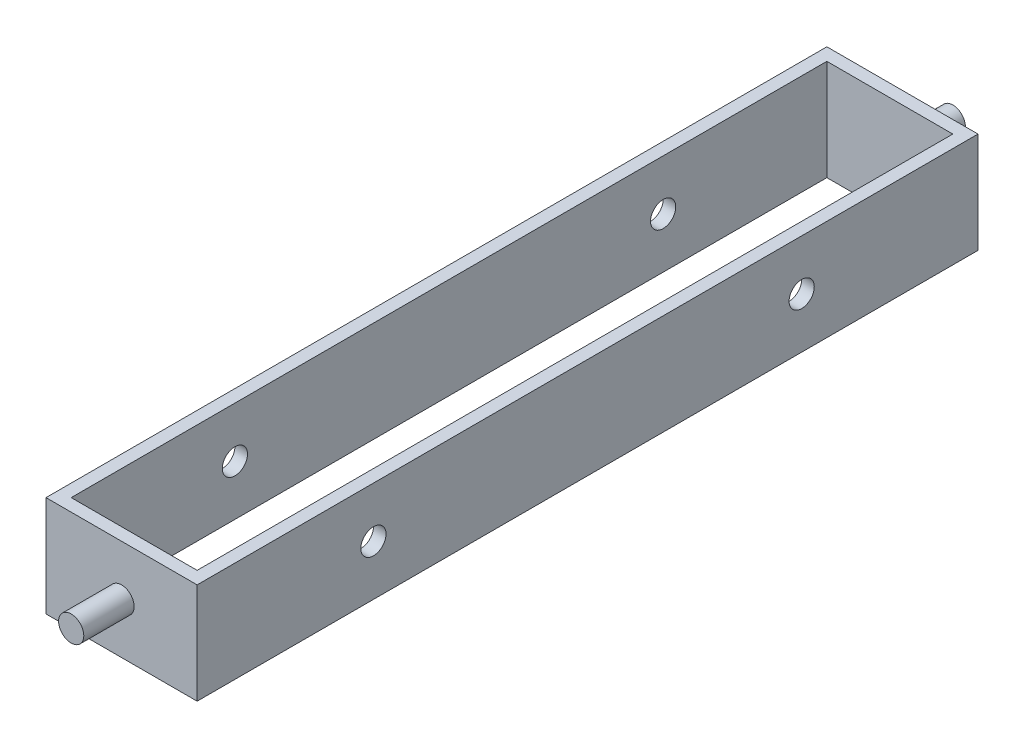
ISO-10303-21;
HEADER;
FILE_DESCRIPTION(('STEP AP214'),'2;1');
FILE_NAME('part.step','',(''),(''),'','','');
FILE_SCHEMA(('AUTOMOTIVE_DESIGN { 1 0 10303 214 1 1 1 1 }'));
ENDSEC;
DATA;
#1=APPLICATION_CONTEXT('core data for automotive mechanical design processes');
#2=APPLICATION_PROTOCOL_DEFINITION('international standard','automotive_design',2000,#1);
#3=PRODUCT_CONTEXT('',#1,'mechanical');
#4=PRODUCT('Part','Part','',(#3));
#5=PRODUCT_RELATED_PRODUCT_CATEGORY('part','',(#4));
#6=PRODUCT_DEFINITION_FORMATION('','',#4);
#7=PRODUCT_DEFINITION_CONTEXT('part definition',#1,'design');
#8=PRODUCT_DEFINITION('design','',#6,#7);
#9=PRODUCT_DEFINITION_SHAPE('','',#8);
#10=(LENGTH_UNIT() NAMED_UNIT(*) SI_UNIT(.MILLI.,.METRE.));
#11=(NAMED_UNIT(*) PLANE_ANGLE_UNIT() SI_UNIT($,.RADIAN.));
#12=(NAMED_UNIT(*) SI_UNIT($,.STERADIAN.) SOLID_ANGLE_UNIT());
#13=UNCERTAINTY_MEASURE_WITH_UNIT(LENGTH_MEASURE(1.E-05),#10,'distance_accuracy_value','');
#14=(GEOMETRIC_REPRESENTATION_CONTEXT(3) GLOBAL_UNCERTAINTY_ASSIGNED_CONTEXT((#13)) GLOBAL_UNIT_ASSIGNED_CONTEXT((#10,
#11,#12)) REPRESENTATION_CONTEXT('',''));
#15=CARTESIAN_POINT('',(0.,0.,0.));
#16=DIRECTION('',(0.,0.,1.));
#17=DIRECTION('',(1.,0.,0.));
#18=AXIS2_PLACEMENT_3D('',#15,#16,#17);
#19=CARTESIAN_POINT('',(0.,0.,25.));
#20=DIRECTION('',(0.,0.,-1.));
#21=DIRECTION('',(-1.,0.,0.));
#22=AXIS2_PLACEMENT_3D('',#19,#20,#21);
#23=PLANE('',#22);
#24=DIRECTION('',(0.,-1.,0.));
#25=VECTOR('',#24,1.);
#26=CARTESIAN_POINT('',(25.,0.,25.));
#27=LINE('',#26,#25);
#28=CARTESIAN_POINT('',(25.,20.,25.));
#29=VERTEX_POINT('',#28);
#30=CARTESIAN_POINT('',(25.,-20.,25.));
#31=VERTEX_POINT('',#30);
#32=EDGE_CURVE('E57',#29,#31,#27,.T.);
#33=ORIENTED_EDGE('',*,*,#32,.F.);
#34=DIRECTION('',(-1.,0.,0.));
#35=VECTOR('',#34,1.);
#36=CARTESIAN_POINT('',(-30.,20.,25.));
#37=LINE('',#36,#35);
#38=CARTESIAN_POINT('',(-25.,20.,25.));
#39=VERTEX_POINT('',#38);
#40=EDGE_CURVE('E174',#29,#39,#37,.T.);
#41=ORIENTED_EDGE('',*,*,#40,.T.);
#42=DIRECTION('',(0.,-1.,0.));
#43=VECTOR('',#42,1.);
#44=CARTESIAN_POINT('',(-25.,0.,25.));
#45=LINE('',#44,#43);
#46=CARTESIAN_POINT('',(-25.,-20.,25.));
#47=VERTEX_POINT('',#46);
#48=EDGE_CURVE('E152',#39,#47,#45,.T.);
#49=ORIENTED_EDGE('',*,*,#48,.T.);
#50=DIRECTION('',(1.,0.,0.));
#51=VECTOR('',#50,1.);
#52=CARTESIAN_POINT('',(-30.,-20.,25.));
#53=LINE('',#52,#51);
#54=EDGE_CURVE('E53',#47,#31,#53,.T.);
#55=ORIENTED_EDGE('',*,*,#54,.T.);
#56=EDGE_LOOP('',(#33,#41,#49,#55));
#57=FACE_BOUND('',#56,.T.);
#58=ADVANCED_FACE('F36',(#57),#23,.F.);
#59=CARTESIAN_POINT('',(0.,0.,20.));
#60=DIRECTION('',(0.,0.,-1.));
#61=DIRECTION('',(-1.,0.,0.));
#62=AXIS2_PLACEMENT_3D('',#59,#60,#61);
#63=CYLINDRICAL_SURFACE('',#62,5.);
#64=CARTESIAN_POINT('',(0.,0.,20.));
#65=DIRECTION('',(0.,0.,1.));
#66=DIRECTION('',(1.,0.,0.));
#67=AXIS2_PLACEMENT_3D('',#64,#65,#66);
#68=CIRCLE('',#67,5.);
#69=CARTESIAN_POINT('',(-5.,0.,20.));
#70=VERTEX_POINT('',#69);
#71=EDGE_CURVE('E11',#70,#70,#68,.T.);
#72=CARTESIAN_POINT('',(0.,0.,0.));
#73=DIRECTION('',(0.,0.,1.));
#74=DIRECTION('',(1.,0.,0.));
#75=AXIS2_PLACEMENT_3D('',#72,#73,#74);
#76=CIRCLE('',#75,5.);
#77=CARTESIAN_POINT('',(-5.,0.,0.));
#78=VERTEX_POINT('',#77);
#79=EDGE_CURVE('E45',#78,#78,#76,.T.);
#80=CARTESIAN_POINT('',(-5.,0.,20.));
#81=CARTESIAN_POINT('',(-5.,0.,19.7916666666667));
#82=CARTESIAN_POINT('',(-5.,0.,19.5833333333334));
#83=CARTESIAN_POINT('',(-5.,0.,19.1666666666667));
#84=CARTESIAN_POINT('',(-5.,0.,18.9583333333334));
#85=CARTESIAN_POINT('',(-5.,0.,18.5416666666667));
#86=CARTESIAN_POINT('',(-5.,0.,18.3333333333334));
#87=CARTESIAN_POINT('',(-5.,0.,17.9166666666667));
#88=CARTESIAN_POINT('',(-5.,0.,17.7083333333334));
#89=CARTESIAN_POINT('',(-5.,0.,17.2916666666667));
#90=CARTESIAN_POINT('',(-5.,0.,17.0833333333334));
#91=CARTESIAN_POINT('',(-5.,0.,16.6666666666667));
#92=CARTESIAN_POINT('',(-5.,0.,16.4583333333334));
#93=CARTESIAN_POINT('',(-5.,0.,16.0416666666667));
#94=CARTESIAN_POINT('',(-5.,0.,15.8333333333334));
#95=CARTESIAN_POINT('',(-5.,0.,15.4166666666667));
#96=CARTESIAN_POINT('',(-5.,0.,15.2083333333334));
#97=CARTESIAN_POINT('',(-5.,0.,14.7916666666667));
#98=CARTESIAN_POINT('',(-5.,0.,14.5833333333334));
#99=CARTESIAN_POINT('',(-5.,0.,14.1666666666667));
#100=CARTESIAN_POINT('',(-5.,0.,13.9583333333334));
#101=CARTESIAN_POINT('',(-5.,0.,13.5416666666667));
#102=CARTESIAN_POINT('',(-5.,0.,13.3333333333334));
#103=CARTESIAN_POINT('',(-5.,0.,12.9166666666667));
#104=CARTESIAN_POINT('',(-5.,0.,12.7083333333334));
#105=CARTESIAN_POINT('',(-5.,0.,12.2916666666667));
#106=CARTESIAN_POINT('',(-5.,0.,12.0833333333334));
#107=CARTESIAN_POINT('',(-5.,0.,11.6666666666667));
#108=CARTESIAN_POINT('',(-5.,0.,11.4583333333334));
#109=CARTESIAN_POINT('',(-5.,0.,11.0416666666667));
#110=CARTESIAN_POINT('',(-5.,0.,10.8333333333334));
#111=CARTESIAN_POINT('',(-5.,0.,10.4166666666667));
#112=CARTESIAN_POINT('',(-5.,0.,10.2083333333333));
#113=CARTESIAN_POINT('',(-5.,0.,9.79166666666668));
#114=CARTESIAN_POINT('',(-5.,0.,9.58333333333335));
#115=CARTESIAN_POINT('',(-5.,0.,9.16666666666668));
#116=CARTESIAN_POINT('',(-5.,0.,8.95833333333335));
#117=CARTESIAN_POINT('',(-5.,0.,8.54166666666668));
#118=CARTESIAN_POINT('',(-5.,0.,8.33333333333335));
#119=CARTESIAN_POINT('',(-5.,0.,7.91666666666668));
#120=CARTESIAN_POINT('',(-5.,0.,7.70833333333335));
#121=CARTESIAN_POINT('',(-5.,0.,7.29166666666668));
#122=CARTESIAN_POINT('',(-5.,0.,7.08333333333335));
#123=CARTESIAN_POINT('',(-5.,0.,6.66666666666668));
#124=CARTESIAN_POINT('',(-5.,0.,6.45833333333334));
#125=CARTESIAN_POINT('',(-5.,0.,6.04166666666667));
#126=CARTESIAN_POINT('',(-5.,0.,5.83333333333334));
#127=CARTESIAN_POINT('',(-5.,0.,5.41666666666667));
#128=CARTESIAN_POINT('',(-5.,0.,5.20833333333334));
#129=CARTESIAN_POINT('',(-5.,0.,4.79166666666667));
#130=CARTESIAN_POINT('',(-5.,0.,4.58333333333334));
#131=CARTESIAN_POINT('',(-5.,0.,4.16666666666667));
#132=CARTESIAN_POINT('',(-5.,0.,3.95833333333334));
#133=CARTESIAN_POINT('',(-5.,0.,3.54166666666667));
#134=CARTESIAN_POINT('',(-5.,0.,3.33333333333334));
#135=CARTESIAN_POINT('',(-5.,0.,2.91666666666667));
#136=CARTESIAN_POINT('',(-5.,0.,2.70833333333334));
#137=CARTESIAN_POINT('',(-5.,0.,2.29166666666667));
#138=CARTESIAN_POINT('',(-5.,0.,2.08333333333334));
#139=CARTESIAN_POINT('',(-5.,0.,1.66666666666667));
#140=CARTESIAN_POINT('',(-5.,0.,1.45833333333333));
#141=CARTESIAN_POINT('',(-5.,0.,1.04166666666666));
#142=CARTESIAN_POINT('',(-5.,0.,0.833333333333331));
#143=CARTESIAN_POINT('',(-5.,0.,0.416666666666664));
#144=CARTESIAN_POINT('',(-5.,0.,0.20833333333333));
#145=CARTESIAN_POINT('',(-5.,0.,0.));
#146=B_SPLINE_CURVE_WITH_KNOTS('',3,(#80,#81,#82,#83,#84,#85,#86,#87,#88,#89,#90,#91,#92,#93,
#94,#95,#96,#97,#98,#99,#100,#101,#102,#103,#104,#105,#106,#107,#108,#109,#110,#111,#112,#113,
#114,#115,#116,#117,#118,#119,#120,#121,#122,#123,#124,#125,#126,#127,#128,#129,#130,#131,#132,
#133,#134,#135,#136,#137,#138,#139,#140,#141,#142,#143,#144,#145),.UNSPECIFIED.,.F.,.F.,(4,2,2,
2,2,2,2,2,2,2,2,2,2,2,2,2,2,2,2,2,2,2,2,2,2,2,2,2,2,2,2,2,4),(0.,0.625000000000001,1.25,1.875,
2.5,3.12500000000001,3.75000000000001,4.37500000000001,5.00000000000001,5.62500000000001,
6.25000000000001,6.87500000000001,7.50000000000001,8.12500000000001,8.75000000000001,
9.37500000000002,10.,10.625,11.25,11.875,12.5,13.125,13.75,14.375,15.,15.625,16.25,16.875,17.5,
18.125,18.75,19.375,20.),.UNSPECIFIED.);
#147=EDGE_CURVE('BSEAM38',#70,#78,#146,.T.);
#148=ORIENTED_EDGE('',*,*,#71,.F.);
#149=ORIENTED_EDGE('',*,*,#79,.T.);
#150=ORIENTED_EDGE('',*,*,#147,.T.);
#151=ORIENTED_EDGE('',*,*,#147,.F.);
#152=EDGE_LOOP('',(#148,#150,#149,#151));
#153=FACE_BOUND('',#152,.T.);
#154=ADVANCED_FACE('F38',(#153),#63,.T.);
#155=CARTESIAN_POINT('',(0.,0.,0.));
#156=DIRECTION('',(0.,0.,1.));
#157=DIRECTION('',(1.,0.,0.));
#158=AXIS2_PLACEMENT_3D('',#155,#156,#157);
#159=PLANE('',#158);
#160=ORIENTED_EDGE('',*,*,#79,.F.);
#161=EDGE_LOOP('',(#160));
#162=FACE_BOUND('',#161,.T.);
#163=ADVANCED_FACE('F222',(#162),#159,.F.);
#164=CARTESIAN_POINT('',(30.,-20.,25.));
#165=DIRECTION('',(-1.,0.,0.));
#166=DIRECTION('',(0.,0.,1.));
#167=AXIS2_PLACEMENT_3D('',#164,#165,#166);
#168=PLANE('',#167);
#169=CARTESIAN_POINT('',(30.,0.,260.));
#170=DIRECTION('',(1.,0.,0.));
#171=DIRECTION('',(0.,0.,1.));
#172=AXIS2_PLACEMENT_3D('',#169,#170,#171);
#173=CIRCLE('',#172,4.99999999999999);
#174=CARTESIAN_POINT('',(30.,0.,265.));
#175=VERTEX_POINT('',#174);
#176=EDGE_CURVE('E284',#175,#175,#173,.T.);
#177=ORIENTED_EDGE('',*,*,#176,.F.);
#178=EDGE_LOOP('',(#177));
#179=FACE_BOUND('',#178,.T.);
#180=CARTESIAN_POINT('',(30.,0.,90.0000000000001));
#181=DIRECTION('',(1.,0.,0.));
#182=DIRECTION('',(0.,0.,-1.));
#183=AXIS2_PLACEMENT_3D('',#180,#181,#182);
#184=CIRCLE('',#183,5.);
#185=CARTESIAN_POINT('',(30.,0.,85.));
#186=VERTEX_POINT('',#185);
#187=EDGE_CURVE('E179',#186,#186,#184,.T.);
#188=ORIENTED_EDGE('',*,*,#187,.F.);
#189=EDGE_LOOP('',(#188));
#190=FACE_BOUND('',#189,.T.);
#191=DIRECTION('',(0.,1.,0.));
#192=VECTOR('',#191,1.);
#193=CARTESIAN_POINT('',(30.,-20.,20.));
#194=LINE('',#193,#192);
#195=CARTESIAN_POINT('',(30.,-20.,20.));
#196=VERTEX_POINT('',#195);
#197=CARTESIAN_POINT('',(30.,20.,20.));
#198=VERTEX_POINT('',#197);
#199=EDGE_CURVE('E171',#196,#198,#194,.T.);
#200=ORIENTED_EDGE('',*,*,#199,.T.);
#201=DIRECTION('',(0.,0.,-1.));
#202=VECTOR('',#201,1.);
#203=CARTESIAN_POINT('',(30.,20.,25.));
#204=LINE('',#203,#202);
#205=CARTESIAN_POINT('',(30.,20.,330.));
#206=VERTEX_POINT('',#205);
#207=EDGE_CURVE('E252',#206,#198,#204,.T.);
#208=ORIENTED_EDGE('',*,*,#207,.F.);
#209=DIRECTION('',(0.,1.,0.));
#210=VECTOR('',#209,1.);
#211=CARTESIAN_POINT('',(30.,20.,330.));
#212=LINE('',#211,#210);
#213=CARTESIAN_POINT('',(30.,-20.,330.));
#214=VERTEX_POINT('',#213);
#215=EDGE_CURVE('E122',#214,#206,#212,.T.);
#216=ORIENTED_EDGE('',*,*,#215,.F.);
#217=DIRECTION('',(0.,0.,-1.));
#218=VECTOR('',#217,1.);
#219=CARTESIAN_POINT('',(30.,-20.,25.));
#220=LINE('',#219,#218);
#221=EDGE_CURVE('E113',#214,#196,#220,.T.);
#222=ORIENTED_EDGE('',*,*,#221,.T.);
#223=EDGE_LOOP('',(#200,#208,#216,#222));
#224=FACE_BOUND('',#223,.T.);
#225=ADVANCED_FACE('F241',(#179,#190,#224),#168,.F.);
#226=CARTESIAN_POINT('',(-30.,20.,25.));
#227=DIRECTION('',(0.,-1.,0.));
#228=DIRECTION('',(0.,0.,-1.));
#229=AXIS2_PLACEMENT_3D('',#226,#227,#228);
#230=PLANE('',#229);
#231=DIRECTION('',(0.,0.,-1.));
#232=VECTOR('',#231,1.);
#233=CARTESIAN_POINT('',(-30.,20.,25.));
#234=LINE('',#233,#232);
#235=CARTESIAN_POINT('',(-30.,20.,330.));
#236=VERTEX_POINT('',#235);
#237=CARTESIAN_POINT('',(-30.,20.,20.));
#238=VERTEX_POINT('',#237);
#239=EDGE_CURVE('E112',#236,#238,#234,.T.);
#240=ORIENTED_EDGE('',*,*,#239,.F.);
#241=DIRECTION('',(-1.,0.,0.));
#242=VECTOR('',#241,1.);
#243=CARTESIAN_POINT('',(-30.,20.,330.));
#244=LINE('',#243,#242);
#245=EDGE_CURVE('E127',#206,#236,#244,.T.);
#246=ORIENTED_EDGE('',*,*,#245,.F.);
#247=ORIENTED_EDGE('',*,*,#207,.T.);
#248=DIRECTION('',(-1.,0.,0.));
#249=VECTOR('',#248,1.);
#250=CARTESIAN_POINT('',(-30.,20.,20.));
#251=LINE('',#250,#249);
#252=EDGE_CURVE('E260',#198,#238,#251,.T.);
#253=ORIENTED_EDGE('',*,*,#252,.T.);
#254=EDGE_LOOP('',(#240,#246,#247,#253));
#255=FACE_BOUND('',#254,.T.);
#256=DIRECTION('',(-1.,0.,0.));
#257=VECTOR('',#256,1.);
#258=CARTESIAN_POINT('',(-30.,20.,325.));
#259=LINE('',#258,#257);
#260=CARTESIAN_POINT('',(25.,20.,325.));
#261=VERTEX_POINT('',#260);
#262=CARTESIAN_POINT('',(-25.,20.,325.));
#263=VERTEX_POINT('',#262);
#264=EDGE_CURVE('E128',#261,#263,#259,.T.);
#265=ORIENTED_EDGE('',*,*,#264,.T.);
#266=DIRECTION('',(0.,0.,-1.));
#267=VECTOR('',#266,1.);
#268=CARTESIAN_POINT('',(-25.,20.,325.));
#269=LINE('',#268,#267);
#270=EDGE_CURVE('E166',#263,#39,#269,.T.);
#271=ORIENTED_EDGE('',*,*,#270,.T.);
#272=ORIENTED_EDGE('',*,*,#40,.F.);
#273=DIRECTION('',(0.,0.,-1.));
#274=VECTOR('',#273,1.);
#275=CARTESIAN_POINT('',(25.,20.,325.));
#276=LINE('',#275,#274);
#277=EDGE_CURVE('E149',#261,#29,#276,.T.);
#278=ORIENTED_EDGE('',*,*,#277,.F.);
#279=EDGE_LOOP('',(#265,#271,#272,#278));
#280=FACE_BOUND('',#279,.T.);
#281=ADVANCED_FACE('F237',(#255,#280),#230,.F.);
#282=CARTESIAN_POINT('',(-30.,-20.,25.));
#283=DIRECTION('',(1.,0.,0.));
#284=DIRECTION('',(0.,0.,-1.));
#285=AXIS2_PLACEMENT_3D('',#282,#283,#284);
#286=PLANE('',#285);
#287=CARTESIAN_POINT('',(-30.,0.,260.));
#288=DIRECTION('',(1.,0.,0.));
#289=DIRECTION('',(0.,0.,-1.));
#290=AXIS2_PLACEMENT_3D('',#287,#288,#289);
#291=CIRCLE('',#290,4.99999999999999);
#292=CARTESIAN_POINT('',(-30.,0.,255.));
#293=VERTEX_POINT('',#292);
#294=EDGE_CURVE('E186',#293,#293,#291,.T.);
#295=ORIENTED_EDGE('',*,*,#294,.T.);
#296=EDGE_LOOP('',(#295));
#297=FACE_BOUND('',#296,.T.);
#298=CARTESIAN_POINT('',(-30.,0.,90.0000000000001));
#299=DIRECTION('',(1.,0.,0.));
#300=DIRECTION('',(0.,0.,-1.));
#301=AXIS2_PLACEMENT_3D('',#298,#299,#300);
#302=CIRCLE('',#301,5.);
#303=CARTESIAN_POINT('',(-30.,0.,85.));
#304=VERTEX_POINT('',#303);
#305=EDGE_CURVE('E183',#304,#304,#302,.T.);
#306=ORIENTED_EDGE('',*,*,#305,.T.);
#307=EDGE_LOOP('',(#306));
#308=FACE_BOUND('',#307,.T.);
#309=DIRECTION('',(0.,-1.,0.));
#310=VECTOR('',#309,1.);
#311=CARTESIAN_POINT('',(-30.,-20.,20.));
#312=LINE('',#311,#310);
#313=CARTESIAN_POINT('',(-30.,-20.,20.));
#314=VERTEX_POINT('',#313);
#315=EDGE_CURVE('E109',#238,#314,#312,.T.);
#316=ORIENTED_EDGE('',*,*,#315,.T.);
#317=DIRECTION('',(0.,0.,-1.));
#318=VECTOR('',#317,1.);
#319=CARTESIAN_POINT('',(-30.,-20.,25.));
#320=LINE('',#319,#318);
#321=CARTESIAN_POINT('',(-30.,-20.,330.));
#322=VERTEX_POINT('',#321);
#323=EDGE_CURVE('E102',#322,#314,#320,.T.);
#324=ORIENTED_EDGE('',*,*,#323,.F.);
#325=DIRECTION('',(0.,-1.,0.));
#326=VECTOR('',#325,1.);
#327=CARTESIAN_POINT('',(-30.,20.,330.));
#328=LINE('',#327,#326);
#329=EDGE_CURVE('E107',#236,#322,#328,.T.);
#330=ORIENTED_EDGE('',*,*,#329,.F.);
#331=ORIENTED_EDGE('',*,*,#239,.T.);
#332=EDGE_LOOP('',(#316,#324,#330,#331));
#333=FACE_BOUND('',#332,.T.);
#334=ADVANCED_FACE('F104',(#297,#308,#333),#286,.F.);
#335=CARTESIAN_POINT('',(-30.,-20.,25.));
#336=DIRECTION('',(0.,1.,0.));
#337=DIRECTION('',(0.,0.,1.));
#338=AXIS2_PLACEMENT_3D('',#335,#336,#337);
#339=PLANE('',#338);
#340=DIRECTION('',(0.,0.,-1.));
#341=VECTOR('',#340,1.);
#342=CARTESIAN_POINT('',(-25.,-20.,325.));
#343=LINE('',#342,#341);
#344=CARTESIAN_POINT('',(-25.,-20.,325.));
#345=VERTEX_POINT('',#344);
#346=EDGE_CURVE('E156',#345,#47,#343,.T.);
#347=ORIENTED_EDGE('',*,*,#346,.F.);
#348=DIRECTION('',(1.,0.,0.));
#349=VECTOR('',#348,1.);
#350=CARTESIAN_POINT('',(-30.,-20.,325.));
#351=LINE('',#350,#349);
#352=CARTESIAN_POINT('',(25.,-20.,325.));
#353=VERTEX_POINT('',#352);
#354=EDGE_CURVE('E131',#345,#353,#351,.T.);
#355=ORIENTED_EDGE('',*,*,#354,.T.);
#356=DIRECTION('',(0.,0.,-1.));
#357=VECTOR('',#356,1.);
#358=CARTESIAN_POINT('',(25.,-20.,325.));
#359=LINE('',#358,#357);
#360=EDGE_CURVE('E145',#353,#31,#359,.T.);
#361=ORIENTED_EDGE('',*,*,#360,.T.);
#362=ORIENTED_EDGE('',*,*,#54,.F.);
#363=EDGE_LOOP('',(#347,#355,#361,#362));
#364=FACE_BOUND('',#363,.T.);
#365=DIRECTION('',(1.,0.,0.));
#366=VECTOR('',#365,1.);
#367=CARTESIAN_POINT('',(-30.,-20.,20.));
#368=LINE('',#367,#366);
#369=EDGE_CURVE('E175',#314,#196,#368,.T.);
#370=ORIENTED_EDGE('',*,*,#369,.T.);
#371=ORIENTED_EDGE('',*,*,#221,.F.);
#372=DIRECTION('',(1.,0.,0.));
#373=VECTOR('',#372,1.);
#374=CARTESIAN_POINT('',(-30.,-20.,330.));
#375=LINE('',#374,#373);
#376=EDGE_CURVE('E116',#322,#214,#375,.T.);
#377=ORIENTED_EDGE('',*,*,#376,.F.);
#378=ORIENTED_EDGE('',*,*,#323,.T.);
#379=EDGE_LOOP('',(#370,#371,#377,#378));
#380=FACE_BOUND('',#379,.T.);
#381=ADVANCED_FACE('F117',(#364,#380),#339,.F.);
#382=CARTESIAN_POINT('',(0.,0.,20.));
#383=DIRECTION('',(0.,0.,-1.));
#384=DIRECTION('',(-1.,0.,0.));
#385=AXIS2_PLACEMENT_3D('',#382,#383,#384);
#386=PLANE('',#385);
#387=ORIENTED_EDGE('',*,*,#71,.T.);
#388=EDGE_LOOP('',(#387));
#389=FACE_BOUND('',#388,.T.);
#390=ORIENTED_EDGE('',*,*,#199,.F.);
#391=ORIENTED_EDGE('',*,*,#369,.F.);
#392=ORIENTED_EDGE('',*,*,#315,.F.);
#393=ORIENTED_EDGE('',*,*,#252,.F.);
#394=EDGE_LOOP('',(#390,#391,#392,#393));
#395=FACE_BOUND('',#394,.T.);
#396=ADVANCED_FACE('F228',(#389,#395),#386,.T.);
#397=CARTESIAN_POINT('',(-25.,0.,325.));
#398=DIRECTION('',(1.,0.,0.));
#399=DIRECTION('',(0.,1.,0.));
#400=AXIS2_PLACEMENT_3D('',#397,#398,#399);
#401=PLANE('',#400);
#402=CARTESIAN_POINT('',(-25.,0.,260.));
#403=DIRECTION('',(1.,0.,0.));
#404=DIRECTION('',(0.,1.,0.));
#405=AXIS2_PLACEMENT_3D('',#402,#403,#404);
#406=CIRCLE('',#405,4.99999999999999);
#407=CARTESIAN_POINT('',(-25.,4.99999999999999,260.));
#408=VERTEX_POINT('',#407);
#409=EDGE_CURVE('E191',#408,#408,#406,.T.);
#410=ORIENTED_EDGE('',*,*,#409,.F.);
#411=EDGE_LOOP('',(#410));
#412=FACE_BOUND('',#411,.T.);
#413=CARTESIAN_POINT('',(-25.,0.,90.0000000000001));
#414=DIRECTION('',(1.,0.,0.));
#415=DIRECTION('',(0.,1.,0.));
#416=AXIS2_PLACEMENT_3D('',#413,#414,#415);
#417=CIRCLE('',#416,5.);
#418=CARTESIAN_POINT('',(-25.,5.,90.0000000000001));
#419=VERTEX_POINT('',#418);
#420=EDGE_CURVE('E178',#419,#419,#417,.T.);
#421=ORIENTED_EDGE('',*,*,#420,.F.);
#422=EDGE_LOOP('',(#421));
#423=FACE_BOUND('',#422,.T.);
#424=ORIENTED_EDGE('',*,*,#48,.F.);
#425=ORIENTED_EDGE('',*,*,#270,.F.);
#426=DIRECTION('',(0.,-1.,0.));
#427=VECTOR('',#426,1.);
#428=CARTESIAN_POINT('',(-25.,0.,325.));
#429=LINE('',#428,#427);
#430=EDGE_CURVE('E153',#263,#345,#429,.T.);
#431=ORIENTED_EDGE('',*,*,#430,.T.);
#432=ORIENTED_EDGE('',*,*,#346,.T.);
#433=EDGE_LOOP('',(#424,#425,#431,#432));
#434=FACE_BOUND('',#433,.T.);
#435=ADVANCED_FACE('F226',(#412,#423,#434),#401,.T.);
#436=CARTESIAN_POINT('',(25.,0.,325.));
#437=DIRECTION('',(1.,0.,0.));
#438=DIRECTION('',(0.,1.,0.));
#439=AXIS2_PLACEMENT_3D('',#436,#437,#438);
#440=PLANE('',#439);
#441=CARTESIAN_POINT('',(25.,0.,260.));
#442=DIRECTION('',(1.,0.,0.));
#443=DIRECTION('',(0.,1.,0.));
#444=AXIS2_PLACEMENT_3D('',#441,#442,#443);
#445=CIRCLE('',#444,4.99999999999999);
#446=CARTESIAN_POINT('',(25.,4.99999999999999,260.));
#447=VERTEX_POINT('',#446);
#448=EDGE_CURVE('E40',#447,#447,#445,.T.);
#449=ORIENTED_EDGE('',*,*,#448,.T.);
#450=EDGE_LOOP('',(#449));
#451=FACE_BOUND('',#450,.T.);
#452=CARTESIAN_POINT('',(25.,0.,90.0000000000001));
#453=DIRECTION('',(1.,0.,0.));
#454=DIRECTION('',(0.,1.,0.));
#455=AXIS2_PLACEMENT_3D('',#452,#453,#454);
#456=CIRCLE('',#455,5.);
#457=CARTESIAN_POINT('',(25.,5.,90.0000000000001));
#458=VERTEX_POINT('',#457);
#459=EDGE_CURVE('E176',#458,#458,#456,.T.);
#460=ORIENTED_EDGE('',*,*,#459,.T.);
#461=EDGE_LOOP('',(#460));
#462=FACE_BOUND('',#461,.T.);
#463=ORIENTED_EDGE('',*,*,#32,.T.);
#464=ORIENTED_EDGE('',*,*,#360,.F.);
#465=DIRECTION('',(0.,-1.,0.));
#466=VECTOR('',#465,1.);
#467=CARTESIAN_POINT('',(25.,0.,325.));
#468=LINE('',#467,#466);
#469=EDGE_CURVE('E142',#261,#353,#468,.T.);
#470=ORIENTED_EDGE('',*,*,#469,.F.);
#471=ORIENTED_EDGE('',*,*,#277,.T.);
#472=EDGE_LOOP('',(#463,#464,#470,#471));
#473=FACE_BOUND('',#472,.T.);
#474=ADVANCED_FACE('F214',(#451,#462,#473),#440,.F.);
#475=CARTESIAN_POINT('',(0.,0.,325.));
#476=DIRECTION('',(0.,0.,1.));
#477=DIRECTION('',(1.,0.,0.));
#478=AXIS2_PLACEMENT_3D('',#475,#476,#477);
#479=PLANE('',#478);
#480=ORIENTED_EDGE('',*,*,#430,.F.);
#481=ORIENTED_EDGE('',*,*,#264,.F.);
#482=ORIENTED_EDGE('',*,*,#469,.T.);
#483=ORIENTED_EDGE('',*,*,#354,.F.);
#484=EDGE_LOOP('',(#480,#481,#482,#483));
#485=FACE_BOUND('',#484,.T.);
#486=ADVANCED_FACE('F205',(#485),#479,.F.);
#487=CARTESIAN_POINT('',(0.,0.,330.));
#488=DIRECTION('',(0.,0.,1.));
#489=DIRECTION('',(1.,0.,0.));
#490=AXIS2_PLACEMENT_3D('',#487,#488,#489);
#491=PLANE('',#490);
#492=CARTESIAN_POINT('',(0.,0.,330.));
#493=DIRECTION('',(0.,0.,1.));
#494=DIRECTION('',(1.,0.,0.));
#495=AXIS2_PLACEMENT_3D('',#492,#493,#494);
#496=CIRCLE('',#495,5.);
#497=CARTESIAN_POINT('',(5.,0.,330.));
#498=VERTEX_POINT('',#497);
#499=EDGE_CURVE('E134',#498,#498,#496,.T.);
#500=ORIENTED_EDGE('',*,*,#499,.F.);
#501=EDGE_LOOP('',(#500));
#502=FACE_BOUND('',#501,.T.);
#503=ORIENTED_EDGE('',*,*,#329,.T.);
#504=ORIENTED_EDGE('',*,*,#376,.T.);
#505=ORIENTED_EDGE('',*,*,#215,.T.);
#506=ORIENTED_EDGE('',*,*,#245,.T.);
#507=EDGE_LOOP('',(#503,#504,#505,#506));
#508=FACE_BOUND('',#507,.T.);
#509=ADVANCED_FACE('F125',(#502,#508),#491,.T.);
#510=CARTESIAN_POINT('',(0.,0.,350.));
#511=DIRECTION('',(0.,0.,-1.));
#512=DIRECTION('',(-1.,0.,0.));
#513=AXIS2_PLACEMENT_3D('',#510,#511,#512);
#514=CYLINDRICAL_SURFACE('',#513,5.);
#515=CARTESIAN_POINT('',(0.,0.,350.));
#516=DIRECTION('',(0.,0.,1.));
#517=DIRECTION('',(1.,0.,0.));
#518=AXIS2_PLACEMENT_3D('',#515,#516,#517);
#519=CIRCLE('',#518,5.);
#520=CARTESIAN_POINT('',(5.,0.,350.));
#521=VERTEX_POINT('',#520);
#522=EDGE_CURVE('E140',#521,#521,#519,.T.);
#523=ORIENTED_EDGE('',*,*,#522,.F.);
#524=EDGE_LOOP('',(#523));
#525=FACE_BOUND('',#524,.T.);
#526=ORIENTED_EDGE('',*,*,#499,.T.);
#527=EDGE_LOOP('',(#526));
#528=FACE_BOUND('',#527,.T.);
#529=ADVANCED_FACE('F202',(#525,#528),#514,.T.);
#530=CARTESIAN_POINT('',(0.,0.,350.));
#531=DIRECTION('',(0.,0.,1.));
#532=DIRECTION('',(1.,0.,0.));
#533=AXIS2_PLACEMENT_3D('',#530,#531,#532);
#534=PLANE('',#533);
#535=ORIENTED_EDGE('',*,*,#522,.T.);
#536=EDGE_LOOP('',(#535));
#537=FACE_BOUND('',#536,.T.);
#538=ADVANCED_FACE('F211',(#537),#534,.T.);
#539=CARTESIAN_POINT('',(-66.,0.,90.0000000000001));
#540=DIRECTION('',(1.,0.,0.));
#541=DIRECTION('',(0.,0.,-1.));
#542=AXIS2_PLACEMENT_3D('',#539,#540,#541);
#543=CYLINDRICAL_SURFACE('',#542,5.);
#544=ORIENTED_EDGE('',*,*,#187,.T.);
#545=EDGE_LOOP('',(#544));
#546=FACE_BOUND('',#545,.T.);
#547=ORIENTED_EDGE('',*,*,#459,.F.);
#548=EDGE_LOOP('',(#547));
#549=FACE_BOUND('',#548,.T.);
#550=ADVANCED_FACE('F301',(#546,#549),#543,.F.);
#551=ORIENTED_EDGE('',*,*,#420,.T.);
#552=EDGE_LOOP('',(#551));
#553=FACE_BOUND('',#552,.T.);
#554=ORIENTED_EDGE('',*,*,#305,.F.);
#555=EDGE_LOOP('',(#554));
#556=FACE_BOUND('',#555,.T.);
#557=ADVANCED_FACE('F294',(#553,#556),#543,.F.);
#558=CARTESIAN_POINT('',(-66.,0.,260.));
#559=DIRECTION('',(1.,0.,0.));
#560=DIRECTION('',(0.,0.,-1.));
#561=AXIS2_PLACEMENT_3D('',#558,#559,#560);
#562=CYLINDRICAL_SURFACE('',#561,4.99999999999999);
#563=ORIENTED_EDGE('',*,*,#176,.T.);
#564=EDGE_LOOP('',(#563));
#565=FACE_BOUND('',#564,.T.);
#566=ORIENTED_EDGE('',*,*,#448,.F.);
#567=EDGE_LOOP('',(#566));
#568=FACE_BOUND('',#567,.T.);
#569=ADVANCED_FACE('F290',(#565,#568),#562,.F.);
#570=ORIENTED_EDGE('',*,*,#409,.T.);
#571=EDGE_LOOP('',(#570));
#572=FACE_BOUND('',#571,.T.);
#573=ORIENTED_EDGE('',*,*,#294,.F.);
#574=EDGE_LOOP('',(#573));
#575=FACE_BOUND('',#574,.T.);
#576=ADVANCED_FACE('F293',(#572,#575),#562,.F.);
#577=CLOSED_SHELL('',(#58,#154,#163,#225,#281,#334,#381,#396,#435,#474,#486,#509,#529,#538,#550,
#557,#569,#576));
#578=MANIFOLD_SOLID_BREP('B2',#577);
#579=ADVANCED_BREP_SHAPE_REPRESENTATION('',(#18,#578),#14);
#580=SHAPE_DEFINITION_REPRESENTATION(#9,#579);
ENDSEC;
END-ISO-10303-21;
